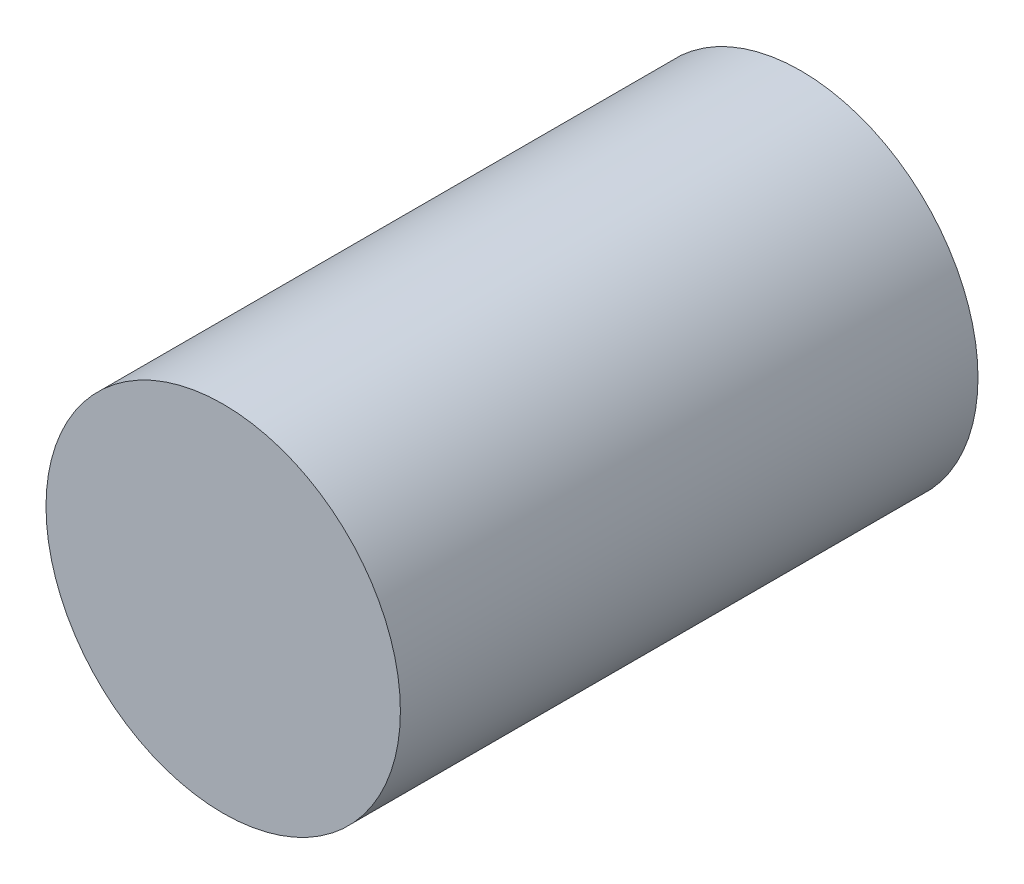
ISO-10303-21;
HEADER;
FILE_DESCRIPTION(('STEP AP214'),'2;1');
FILE_NAME('part.step','',(''),(''),'','','');
FILE_SCHEMA(('AUTOMOTIVE_DESIGN { 1 0 10303 214 1 1 1 1 }'));
ENDSEC;
DATA;
#1=APPLICATION_CONTEXT('core data for automotive mechanical design processes');
#2=APPLICATION_PROTOCOL_DEFINITION('international standard','automotive_design',2000,#1);
#3=PRODUCT_CONTEXT('',#1,'mechanical');
#4=PRODUCT('Part','Part','',(#3));
#5=PRODUCT_RELATED_PRODUCT_CATEGORY('part','',(#4));
#6=PRODUCT_DEFINITION_FORMATION('','',#4);
#7=PRODUCT_DEFINITION_CONTEXT('part definition',#1,'design');
#8=PRODUCT_DEFINITION('design','',#6,#7);
#9=PRODUCT_DEFINITION_SHAPE('','',#8);
#10=(LENGTH_UNIT() NAMED_UNIT(*) SI_UNIT(.MILLI.,.METRE.));
#11=(NAMED_UNIT(*) PLANE_ANGLE_UNIT() SI_UNIT($,.RADIAN.));
#12=(NAMED_UNIT(*) SI_UNIT($,.STERADIAN.) SOLID_ANGLE_UNIT());
#13=UNCERTAINTY_MEASURE_WITH_UNIT(LENGTH_MEASURE(1.E-05),#10,'distance_accuracy_value','');
#14=(GEOMETRIC_REPRESENTATION_CONTEXT(3) GLOBAL_UNCERTAINTY_ASSIGNED_CONTEXT((#13)) GLOBAL_UNIT_ASSIGNED_CONTEXT((#10,
#11,#12)) REPRESENTATION_CONTEXT('',''));
#15=CARTESIAN_POINT('',(0.,0.,0.));
#16=DIRECTION('',(0.,0.,1.));
#17=DIRECTION('',(1.,0.,0.));
#18=AXIS2_PLACEMENT_3D('',#15,#16,#17);
#19=CARTESIAN_POINT('',(0.,0.,76.2));
#20=DIRECTION('',(0.,0.,-1.));
#21=DIRECTION('',(-1.,0.,0.));
#22=AXIS2_PLACEMENT_3D('',#19,#20,#21);
#23=CYLINDRICAL_SURFACE('',#22,23.3770064456076);
#24=CARTESIAN_POINT('',(0.,0.,76.2));
#25=DIRECTION('',(0.,0.,1.));
#26=DIRECTION('',(1.,0.,0.));
#27=AXIS2_PLACEMENT_3D('',#24,#25,#26);
#28=CIRCLE('',#27,23.3770064456076);
#29=CARTESIAN_POINT('',(-23.3770064456076,0.,76.2));
#30=VERTEX_POINT('',#29);
#31=EDGE_CURVE('E10',#30,#30,#28,.T.);
#32=CARTESIAN_POINT('',(0.,0.,0.));
#33=DIRECTION('',(0.,0.,1.));
#34=DIRECTION('',(1.,0.,0.));
#35=AXIS2_PLACEMENT_3D('',#32,#33,#34);
#36=CIRCLE('',#35,23.3770064456076);
#37=CARTESIAN_POINT('',(-23.3770064456076,0.,0.));
#38=VERTEX_POINT('',#37);
#39=EDGE_CURVE('E33',#38,#38,#36,.T.);
#40=CARTESIAN_POINT('',(-23.3770064456076,0.,76.2));
#41=CARTESIAN_POINT('',(-23.3770064456076,0.,75.40625));
#42=CARTESIAN_POINT('',(-23.3770064456076,0.,74.6125));
#43=CARTESIAN_POINT('',(-23.3770064456076,0.,73.025));
#44=CARTESIAN_POINT('',(-23.3770064456076,0.,72.23125));
#45=CARTESIAN_POINT('',(-23.3770064456076,0.,70.64375));
#46=CARTESIAN_POINT('',(-23.3770064456076,0.,69.85));
#47=CARTESIAN_POINT('',(-23.3770064456076,0.,68.2625));
#48=CARTESIAN_POINT('',(-23.3770064456076,0.,67.46875));
#49=CARTESIAN_POINT('',(-23.3770064456076,0.,65.88125));
#50=CARTESIAN_POINT('',(-23.3770064456076,0.,65.0875));
#51=CARTESIAN_POINT('',(-23.3770064456076,0.,63.5));
#52=CARTESIAN_POINT('',(-23.3770064456076,0.,62.70625));
#53=CARTESIAN_POINT('',(-23.3770064456076,0.,61.11875));
#54=CARTESIAN_POINT('',(-23.3770064456076,0.,60.325));
#55=CARTESIAN_POINT('',(-23.3770064456076,0.,58.7375));
#56=CARTESIAN_POINT('',(-23.3770064456076,0.,57.94375));
#57=CARTESIAN_POINT('',(-23.3770064456076,0.,56.35625));
#58=CARTESIAN_POINT('',(-23.3770064456076,0.,55.5625));
#59=CARTESIAN_POINT('',(-23.3770064456076,0.,53.975));
#60=CARTESIAN_POINT('',(-23.3770064456076,0.,53.18125));
#61=CARTESIAN_POINT('',(-23.3770064456076,0.,51.59375));
#62=CARTESIAN_POINT('',(-23.3770064456076,0.,50.8));
#63=CARTESIAN_POINT('',(-23.3770064456076,0.,49.2125));
#64=CARTESIAN_POINT('',(-23.3770064456076,0.,48.41875));
#65=CARTESIAN_POINT('',(-23.3770064456076,0.,46.83125));
#66=CARTESIAN_POINT('',(-23.3770064456076,0.,46.0375));
#67=CARTESIAN_POINT('',(-23.3770064456076,0.,44.45));
#68=CARTESIAN_POINT('',(-23.3770064456076,0.,43.65625));
#69=CARTESIAN_POINT('',(-23.3770064456076,0.,42.06875));
#70=CARTESIAN_POINT('',(-23.3770064456076,0.,41.275));
#71=CARTESIAN_POINT('',(-23.3770064456076,0.,39.6875));
#72=CARTESIAN_POINT('',(-23.3770064456076,0.,38.89375));
#73=CARTESIAN_POINT('',(-23.3770064456076,0.,37.30625));
#74=CARTESIAN_POINT('',(-23.3770064456076,0.,36.5125));
#75=CARTESIAN_POINT('',(-23.3770064456076,0.,34.925));
#76=CARTESIAN_POINT('',(-23.3770064456076,0.,34.13125));
#77=CARTESIAN_POINT('',(-23.3770064456076,0.,32.54375));
#78=CARTESIAN_POINT('',(-23.3770064456076,0.,31.75));
#79=CARTESIAN_POINT('',(-23.3770064456076,0.,30.1625));
#80=CARTESIAN_POINT('',(-23.3770064456076,0.,29.36875));
#81=CARTESIAN_POINT('',(-23.3770064456076,0.,27.78125));
#82=CARTESIAN_POINT('',(-23.3770064456076,0.,26.9875));
#83=CARTESIAN_POINT('',(-23.3770064456076,0.,25.4));
#84=CARTESIAN_POINT('',(-23.3770064456076,0.,24.60625));
#85=CARTESIAN_POINT('',(-23.3770064456076,0.,23.01875));
#86=CARTESIAN_POINT('',(-23.3770064456076,0.,22.225));
#87=CARTESIAN_POINT('',(-23.3770064456076,0.,20.6375));
#88=CARTESIAN_POINT('',(-23.3770064456076,0.,19.84375));
#89=CARTESIAN_POINT('',(-23.3770064456076,0.,18.25625));
#90=CARTESIAN_POINT('',(-23.3770064456076,0.,17.4625));
#91=CARTESIAN_POINT('',(-23.3770064456076,0.,15.875));
#92=CARTESIAN_POINT('',(-23.3770064456076,0.,15.08125));
#93=CARTESIAN_POINT('',(-23.3770064456076,0.,13.49375));
#94=CARTESIAN_POINT('',(-23.3770064456076,0.,12.7));
#95=CARTESIAN_POINT('',(-23.3770064456076,0.,11.1125));
#96=CARTESIAN_POINT('',(-23.3770064456076,0.,10.31875));
#97=CARTESIAN_POINT('',(-23.3770064456076,0.,8.73125));
#98=CARTESIAN_POINT('',(-23.3770064456076,0.,7.93750000000001));
#99=CARTESIAN_POINT('',(-23.3770064456076,0.,6.35));
#100=CARTESIAN_POINT('',(-23.3770064456076,0.,5.55625));
#101=CARTESIAN_POINT('',(-23.3770064456076,0.,3.96875));
#102=CARTESIAN_POINT('',(-23.3770064456076,0.,3.175));
#103=CARTESIAN_POINT('',(-23.3770064456076,0.,1.5875));
#104=CARTESIAN_POINT('',(-23.3770064456076,0.,0.793750000000001));
#105=CARTESIAN_POINT('',(-23.3770064456076,0.,0.));
#106=B_SPLINE_CURVE_WITH_KNOTS('',3,(#40,#41,#42,#43,#44,#45,#46,#47,#48,#49,#50,#51,#52,#53,
#54,#55,#56,#57,#58,#59,#60,#61,#62,#63,#64,#65,#66,#67,#68,#69,#70,#71,#72,#73,#74,#75,#76,#77,
#78,#79,#80,#81,#82,#83,#84,#85,#86,#87,#88,#89,#90,#91,#92,#93,#94,#95,#96,#97,#98,#99,#100,
#101,#102,#103,#104,#105),.UNSPECIFIED.,.F.,.F.,(4,2,2,2,2,2,2,2,2,2,2,2,2,2,2,2,2,2,2,2,2,2,2,
2,2,2,2,2,2,2,2,2,4),(0.,2.38124999999999,4.76249999999999,7.14374999999999,9.52499999999999,
11.90625,14.2875,16.66875,19.05,21.43125,23.8125,26.19375,28.575,30.95625,33.3375,35.71875,38.1,
40.48125,42.8625,45.24375,47.625,50.00625,52.3875,54.76875,57.15,59.53125,61.9125,64.29375,
66.675,69.05625,71.4375,73.81875,76.2),.UNSPECIFIED.);
#107=EDGE_CURVE('BSEAM27',#30,#38,#106,.T.);
#108=ORIENTED_EDGE('',*,*,#31,.F.);
#109=ORIENTED_EDGE('',*,*,#39,.T.);
#110=ORIENTED_EDGE('',*,*,#107,.T.);
#111=ORIENTED_EDGE('',*,*,#107,.F.);
#112=EDGE_LOOP('',(#108,#110,#109,#111));
#113=FACE_BOUND('',#112,.T.);
#114=ADVANCED_FACE('F27',(#113),#23,.T.);
#115=CARTESIAN_POINT('',(0.,0.,76.2));
#116=DIRECTION('',(0.,0.,1.));
#117=DIRECTION('',(1.,0.,0.));
#118=AXIS2_PLACEMENT_3D('',#115,#116,#117);
#119=PLANE('',#118);
#120=ORIENTED_EDGE('',*,*,#31,.T.);
#121=EDGE_LOOP('',(#120));
#122=FACE_BOUND('',#121,.T.);
#123=ADVANCED_FACE('F42',(#122),#119,.T.);
#124=CARTESIAN_POINT('',(0.,0.,0.));
#125=DIRECTION('',(0.,0.,1.));
#126=DIRECTION('',(1.,0.,0.));
#127=AXIS2_PLACEMENT_3D('',#124,#125,#126);
#128=PLANE('',#127);
#129=ORIENTED_EDGE('',*,*,#39,.F.);
#130=EDGE_LOOP('',(#129));
#131=FACE_BOUND('',#130,.T.);
#132=ADVANCED_FACE('F40',(#131),#128,.F.);
#133=CLOSED_SHELL('',(#114,#123,#132));
#134=MANIFOLD_SOLID_BREP('B2',#133);
#135=ADVANCED_BREP_SHAPE_REPRESENTATION('',(#18,#134),#14);
#136=SHAPE_DEFINITION_REPRESENTATION(#9,#135);
ENDSEC;
END-ISO-10303-21;
